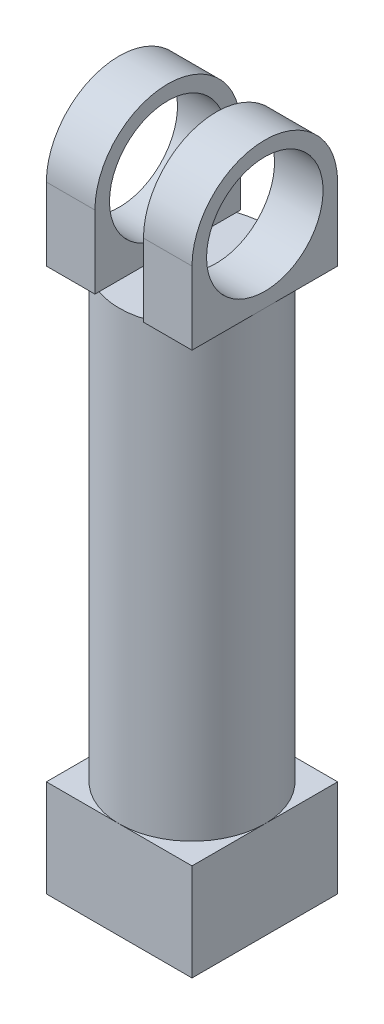
ISO-10303-21;
HEADER;
FILE_DESCRIPTION(('STEP AP214'),'2;1');
FILE_NAME('part.step','',(''),(''),'','','');
FILE_SCHEMA(('AUTOMOTIVE_DESIGN { 1 0 10303 214 1 1 1 1 }'));
ENDSEC;
DATA;
#1=APPLICATION_CONTEXT('core data for automotive mechanical design processes');
#2=APPLICATION_PROTOCOL_DEFINITION('international standard','automotive_design',2000,#1);
#3=PRODUCT_CONTEXT('',#1,'mechanical');
#4=PRODUCT('Part','Part','',(#3));
#5=PRODUCT_RELATED_PRODUCT_CATEGORY('part','',(#4));
#6=PRODUCT_DEFINITION_FORMATION('','',#4);
#7=PRODUCT_DEFINITION_CONTEXT('part definition',#1,'design');
#8=PRODUCT_DEFINITION('design','',#6,#7);
#9=PRODUCT_DEFINITION_SHAPE('','',#8);
#10=(LENGTH_UNIT() NAMED_UNIT(*) SI_UNIT(.MILLI.,.METRE.));
#11=(NAMED_UNIT(*) PLANE_ANGLE_UNIT() SI_UNIT($,.RADIAN.));
#12=(NAMED_UNIT(*) SI_UNIT($,.STERADIAN.) SOLID_ANGLE_UNIT());
#13=UNCERTAINTY_MEASURE_WITH_UNIT(LENGTH_MEASURE(1.E-05),#10,'distance_accuracy_value','');
#14=(GEOMETRIC_REPRESENTATION_CONTEXT(3) GLOBAL_UNCERTAINTY_ASSIGNED_CONTEXT((#13)) GLOBAL_UNIT_ASSIGNED_CONTEXT((#10,
#11,#12)) REPRESENTATION_CONTEXT('',''));
#15=CARTESIAN_POINT('',(0.,0.,0.));
#16=DIRECTION('',(0.,0.,1.));
#17=DIRECTION('',(1.,0.,0.));
#18=AXIS2_PLACEMENT_3D('',#15,#16,#17);
#19=CARTESIAN_POINT('',(0.,61.,-7.5));
#20=DIRECTION('',(0.,0.,1.));
#21=DIRECTION('',(1.,0.,0.));
#22=AXIS2_PLACEMENT_3D('',#19,#20,#21);
#23=PLANE('',#22);
#24=DIRECTION('',(0.,-1.,0.));
#25=VECTOR('',#24,1.);
#26=CARTESIAN_POINT('',(2.5,0.,-7.5));
#27=LINE('',#26,#25);
#28=CARTESIAN_POINT('',(2.5,53.5,-7.5));
#29=VERTEX_POINT('',#28);
#30=CARTESIAN_POINT('',(2.5,46.,-7.5));
#31=VERTEX_POINT('',#30);
#32=EDGE_CURVE('E204',#29,#31,#27,.T.);
#33=ORIENTED_EDGE('',*,*,#32,.F.);
#34=DIRECTION('',(-1.,0.,0.));
#35=VECTOR('',#34,1.);
#36=CARTESIAN_POINT('',(7.5,53.5,-7.5));
#37=LINE('',#36,#35);
#38=CARTESIAN_POINT('',(7.5,53.5,-7.5));
#39=VERTEX_POINT('',#38);
#40=EDGE_CURVE('E213',#39,#29,#37,.T.);
#41=ORIENTED_EDGE('',*,*,#40,.F.);
#42=DIRECTION('',(0.,-1.,0.));
#43=VECTOR('',#42,1.);
#44=CARTESIAN_POINT('',(7.5,61.,-7.5));
#45=LINE('',#44,#43);
#46=CARTESIAN_POINT('',(7.5,46.,-7.5));
#47=VERTEX_POINT('',#46);
#48=EDGE_CURVE('E260',#39,#47,#45,.T.);
#49=ORIENTED_EDGE('',*,*,#48,.T.);
#50=DIRECTION('',(-1.,0.,0.));
#51=VECTOR('',#50,1.);
#52=CARTESIAN_POINT('',(0.,46.,-7.5));
#53=LINE('',#52,#51);
#54=EDGE_CURVE('E256',#47,#31,#53,.T.);
#55=ORIENTED_EDGE('',*,*,#54,.T.);
#56=EDGE_LOOP('',(#33,#41,#49,#55));
#57=FACE_BOUND('',#56,.T.);
#58=ADVANCED_FACE('F67',(#57),#23,.F.);
#59=CARTESIAN_POINT('',(0.,46.,0.));
#60=DIRECTION('',(0.,-1.,0.));
#61=DIRECTION('',(0.,0.,-1.));
#62=AXIS2_PLACEMENT_3D('',#59,#60,#61);
#63=PLANE('',#62);
#64=DIRECTION('',(1.,0.,0.));
#65=VECTOR('',#64,1.);
#66=CARTESIAN_POINT('',(7.5,46.,7.5));
#67=LINE('',#66,#65);
#68=CARTESIAN_POINT('',(2.5,46.,7.5));
#69=VERTEX_POINT('',#68);
#70=CARTESIAN_POINT('',(7.5,46.,7.5));
#71=VERTEX_POINT('',#70);
#72=EDGE_CURVE('E245',#69,#71,#67,.T.);
#73=ORIENTED_EDGE('',*,*,#72,.F.);
#74=DIRECTION('',(0.,0.,1.));
#75=VECTOR('',#74,1.);
#76=CARTESIAN_POINT('',(2.5,46.,0.));
#77=LINE('',#76,#75);
#78=CARTESIAN_POINT('',(2.5,46.,7.07106781186548));
#79=VERTEX_POINT('',#78);
#80=EDGE_CURVE('E199',#79,#69,#77,.T.);
#81=ORIENTED_EDGE('',*,*,#80,.F.);
#82=CARTESIAN_POINT('',(0.,46.,0.));
#83=DIRECTION('',(0.,1.,0.));
#84=DIRECTION('',(0.,0.,1.));
#85=AXIS2_PLACEMENT_3D('',#82,#83,#84);
#86=CIRCLE('',#85,7.5);
#87=CARTESIAN_POINT('',(7.5,46.,0.));
#88=VERTEX_POINT('',#87);
#89=EDGE_CURVE('E77',#79,#88,#86,.T.);
#90=ORIENTED_EDGE('',*,*,#89,.T.);
#91=DIRECTION('',(0.,0.,-1.));
#92=VECTOR('',#91,1.);
#93=CARTESIAN_POINT('',(7.5,46.,-7.5));
#94=LINE('',#93,#92);
#95=EDGE_CURVE('E251',#71,#88,#94,.T.);
#96=ORIENTED_EDGE('',*,*,#95,.F.);
#97=EDGE_LOOP('',(#73,#81,#90,#96));
#98=FACE_BOUND('',#97,.T.);
#99=ADVANCED_FACE('F378',(#98),#63,.T.);
#100=CARTESIAN_POINT('',(2.5,46.,-7.07106781186548));
#101=VERTEX_POINT('',#100);
#102=EDGE_CURVE('E79',#88,#101,#86,.T.);
#103=ORIENTED_EDGE('',*,*,#102,.T.);
#104=EDGE_CURVE('E353',#31,#101,#77,.T.);
#105=ORIENTED_EDGE('',*,*,#104,.F.);
#106=ORIENTED_EDGE('',*,*,#54,.F.);
#107=EDGE_CURVE('E250',#88,#47,#94,.T.);
#108=ORIENTED_EDGE('',*,*,#107,.F.);
#109=EDGE_LOOP('',(#103,#105,#106,#108));
#110=FACE_BOUND('',#109,.T.);
#111=ADVANCED_FACE('F474',(#110),#63,.T.);
#112=CARTESIAN_POINT('',(7.5,61.,7.5));
#113=DIRECTION('',(0.,0.,-1.));
#114=DIRECTION('',(-1.,0.,0.));
#115=AXIS2_PLACEMENT_3D('',#112,#113,#114);
#116=PLANE('',#115);
#117=DIRECTION('',(0.,1.,0.));
#118=VECTOR('',#117,1.);
#119=CARTESIAN_POINT('',(2.5,0.,7.5));
#120=LINE('',#119,#118);
#121=CARTESIAN_POINT('',(2.5,53.5,7.5));
#122=VERTEX_POINT('',#121);
#123=EDGE_CURVE('E192',#69,#122,#120,.T.);
#124=ORIENTED_EDGE('',*,*,#123,.F.);
#125=ORIENTED_EDGE('',*,*,#72,.T.);
#126=DIRECTION('',(0.,-1.,0.));
#127=VECTOR('',#126,1.);
#128=CARTESIAN_POINT('',(7.5,61.,7.5));
#129=LINE('',#128,#127);
#130=CARTESIAN_POINT('',(7.5,53.5,7.5));
#131=VERTEX_POINT('',#130);
#132=EDGE_CURVE('E220',#131,#71,#129,.T.);
#133=ORIENTED_EDGE('',*,*,#132,.F.);
#134=DIRECTION('',(-1.,0.,0.));
#135=VECTOR('',#134,1.);
#136=CARTESIAN_POINT('',(7.5,53.5,7.5));
#137=LINE('',#136,#135);
#138=EDGE_CURVE('E210',#131,#122,#137,.T.);
#139=ORIENTED_EDGE('',*,*,#138,.T.);
#140=EDGE_LOOP('',(#124,#125,#133,#139));
#141=FACE_BOUND('',#140,.T.);
#142=ADVANCED_FACE('F218',(#141),#116,.F.);
#143=CARTESIAN_POINT('',(7.5,53.5,0.));
#144=DIRECTION('',(-1.,0.,0.));
#145=DIRECTION('',(0.,0.,1.));
#146=AXIS2_PLACEMENT_3D('',#143,#144,#145);
#147=CYLINDRICAL_SURFACE('',#146,7.5);
#148=ORIENTED_EDGE('',*,*,#40,.T.);
#149=CARTESIAN_POINT('',(2.5,53.5,0.));
#150=DIRECTION('',(-1.,0.,0.));
#151=DIRECTION('',(0.,0.,1.));
#152=AXIS2_PLACEMENT_3D('',#149,#150,#151);
#153=CIRCLE('',#152,7.5);
#154=EDGE_CURVE('E195',#122,#29,#153,.T.);
#155=ORIENTED_EDGE('',*,*,#154,.F.);
#156=ORIENTED_EDGE('',*,*,#138,.F.);
#157=CARTESIAN_POINT('',(7.5,53.5,0.));
#158=DIRECTION('',(-1.,0.,0.));
#159=DIRECTION('',(0.,0.,1.));
#160=AXIS2_PLACEMENT_3D('',#157,#158,#159);
#161=CIRCLE('',#160,7.5);
#162=EDGE_CURVE('E228',#131,#39,#161,.T.);
#163=ORIENTED_EDGE('',*,*,#162,.T.);
#164=EDGE_LOOP('',(#148,#155,#156,#163));
#165=FACE_BOUND('',#164,.T.);
#166=ADVANCED_FACE('F209',(#165),#147,.T.);
#167=CARTESIAN_POINT('',(7.5,53.5,0.));
#168=DIRECTION('',(-1.,0.,0.));
#169=DIRECTION('',(0.,0.,1.));
#170=AXIS2_PLACEMENT_3D('',#167,#168,#169);
#171=CYLINDRICAL_SURFACE('',#170,6.);
#172=CARTESIAN_POINT('',(7.5,53.5,0.));
#173=DIRECTION('',(-1.,0.,0.));
#174=DIRECTION('',(0.,0.,1.));
#175=AXIS2_PLACEMENT_3D('',#172,#173,#174);
#176=CIRCLE('',#175,6.);
#177=CARTESIAN_POINT('',(7.5,53.5,6.));
#178=VERTEX_POINT('',#177);
#179=EDGE_CURVE('E230',#178,#178,#176,.T.);
#180=ORIENTED_EDGE('',*,*,#179,.F.);
#181=EDGE_LOOP('',(#180));
#182=FACE_BOUND('',#181,.T.);
#183=CARTESIAN_POINT('',(2.5,53.5,0.));
#184=DIRECTION('',(-1.,0.,0.));
#185=DIRECTION('',(0.,0.,1.));
#186=AXIS2_PLACEMENT_3D('',#183,#184,#185);
#187=CIRCLE('',#186,6.);
#188=CARTESIAN_POINT('',(2.5,53.5,6.));
#189=VERTEX_POINT('',#188);
#190=EDGE_CURVE('E71',#189,#189,#187,.F.);
#191=ORIENTED_EDGE('',*,*,#190,.F.);
#192=EDGE_LOOP('',(#191));
#193=FACE_BOUND('',#192,.T.);
#194=ADVANCED_FACE('F487',(#182,#193),#171,.F.);
#195=CARTESIAN_POINT('',(-7.5,61.,7.5));
#196=DIRECTION('',(1.,0.,0.));
#197=DIRECTION('',(0.,0.,-1.));
#198=AXIS2_PLACEMENT_3D('',#195,#196,#197);
#199=PLANE('',#198);
#200=CARTESIAN_POINT('',(-7.5,53.5,0.));
#201=DIRECTION('',(-1.,0.,0.));
#202=DIRECTION('',(0.,0.,1.));
#203=AXIS2_PLACEMENT_3D('',#200,#201,#202);
#204=CIRCLE('',#203,6.);
#205=CARTESIAN_POINT('',(-7.5,53.5,6.));
#206=VERTEX_POINT('',#205);
#207=EDGE_CURVE('E233',#206,#206,#204,.T.);
#208=ORIENTED_EDGE('',*,*,#207,.F.);
#209=EDGE_LOOP('',(#208));
#210=FACE_BOUND('',#209,.T.);
#211=DIRECTION('',(0.,-1.,0.));
#212=VECTOR('',#211,1.);
#213=CARTESIAN_POINT('',(-7.5,61.,7.5));
#214=LINE('',#213,#212);
#215=CARTESIAN_POINT('',(-7.5,53.5,7.5));
#216=VERTEX_POINT('',#215);
#217=CARTESIAN_POINT('',(-7.5,46.,7.5));
#218=VERTEX_POINT('',#217);
#219=EDGE_CURVE('E265',#216,#218,#214,.T.);
#220=ORIENTED_EDGE('',*,*,#219,.F.);
#221=CARTESIAN_POINT('',(-7.5,53.5,0.));
#222=DIRECTION('',(-1.,0.,0.));
#223=DIRECTION('',(0.,0.,1.));
#224=AXIS2_PLACEMENT_3D('',#221,#222,#223);
#225=CIRCLE('',#224,7.5);
#226=CARTESIAN_POINT('',(-7.5,53.5,-7.5));
#227=VERTEX_POINT('',#226);
#228=EDGE_CURVE('E222',#216,#227,#225,.T.);
#229=ORIENTED_EDGE('',*,*,#228,.T.);
#230=DIRECTION('',(0.,-1.,0.));
#231=VECTOR('',#230,1.);
#232=CARTESIAN_POINT('',(-7.5,61.,-7.5));
#233=LINE('',#232,#231);
#234=CARTESIAN_POINT('',(-7.5,46.,-7.5));
#235=VERTEX_POINT('',#234);
#236=EDGE_CURVE('E268',#227,#235,#233,.T.);
#237=ORIENTED_EDGE('',*,*,#236,.T.);
#238=DIRECTION('',(0.,0.,1.));
#239=VECTOR('',#238,1.);
#240=CARTESIAN_POINT('',(-7.5,46.,7.5));
#241=LINE('',#240,#239);
#242=CARTESIAN_POINT('',(-7.5,46.,0.));
#243=VERTEX_POINT('',#242);
#244=EDGE_CURVE('E241',#235,#243,#241,.T.);
#245=ORIENTED_EDGE('',*,*,#244,.T.);
#246=EDGE_CURVE('E240',#243,#218,#241,.T.);
#247=ORIENTED_EDGE('',*,*,#246,.T.);
#248=EDGE_LOOP('',(#220,#229,#237,#245,#247));
#249=FACE_BOUND('',#248,.T.);
#250=ADVANCED_FACE('F483',(#210,#249),#199,.F.);
#251=CARTESIAN_POINT('',(7.5,61.,-7.5));
#252=DIRECTION('',(-1.,0.,0.));
#253=DIRECTION('',(0.,0.,1.));
#254=AXIS2_PLACEMENT_3D('',#251,#252,#253);
#255=PLANE('',#254);
#256=ORIENTED_EDGE('',*,*,#179,.T.);
#257=EDGE_LOOP('',(#256));
#258=FACE_BOUND('',#257,.T.);
#259=ORIENTED_EDGE('',*,*,#162,.F.);
#260=ORIENTED_EDGE('',*,*,#132,.T.);
#261=ORIENTED_EDGE('',*,*,#95,.T.);
#262=ORIENTED_EDGE('',*,*,#107,.T.);
#263=ORIENTED_EDGE('',*,*,#48,.F.);
#264=EDGE_LOOP('',(#259,#260,#261,#262,#263));
#265=FACE_BOUND('',#264,.T.);
#266=ADVANCED_FACE('F478',(#258,#265),#255,.F.);
#267=CARTESIAN_POINT('',(-2.5,53.5,-7.5));
#268=VERTEX_POINT('',#267);
#269=EDGE_CURVE('E236',#268,#227,#37,.T.);
#270=ORIENTED_EDGE('',*,*,#269,.F.);
#271=DIRECTION('',(0.,-1.,0.));
#272=VECTOR('',#271,1.);
#273=CARTESIAN_POINT('',(-2.5,0.,-7.5));
#274=LINE('',#273,#272);
#275=CARTESIAN_POINT('',(-2.5,46.,-7.5));
#276=VERTEX_POINT('',#275);
#277=EDGE_CURVE('E86',#268,#276,#274,.T.);
#278=ORIENTED_EDGE('',*,*,#277,.T.);
#279=EDGE_CURVE('E255',#276,#235,#53,.T.);
#280=ORIENTED_EDGE('',*,*,#279,.T.);
#281=ORIENTED_EDGE('',*,*,#236,.F.);
#282=EDGE_LOOP('',(#270,#278,#280,#281));
#283=FACE_BOUND('',#282,.T.);
#284=ADVANCED_FACE('F405',(#283),#23,.F.);
#285=CARTESIAN_POINT('',(0.,46.,0.));
#286=DIRECTION('',(0.,-1.,0.));
#287=DIRECTION('',(0.,0.,-1.));
#288=AXIS2_PLACEMENT_3D('',#285,#286,#287);
#289=CYLINDRICAL_SURFACE('',#288,7.5);
#290=CARTESIAN_POINT('',(-2.5,46.,7.07106781186548));
#291=VERTEX_POINT('',#290);
#292=EDGE_CURVE('E12',#291,#79,#86,.T.);
#293=ORIENTED_EDGE('',*,*,#292,.F.);
#294=EDGE_CURVE('E333',#243,#291,#86,.T.);
#295=ORIENTED_EDGE('',*,*,#294,.F.);
#296=CARTESIAN_POINT('',(-2.5,46.,-7.07106781186548));
#297=VERTEX_POINT('',#296);
#298=EDGE_CURVE('E94',#297,#243,#86,.T.);
#299=ORIENTED_EDGE('',*,*,#298,.F.);
#300=EDGE_CURVE('E387',#101,#297,#86,.T.);
#301=ORIENTED_EDGE('',*,*,#300,.F.);
#302=ORIENTED_EDGE('',*,*,#102,.F.);
#303=ORIENTED_EDGE('',*,*,#89,.F.);
#304=EDGE_LOOP('',(#293,#295,#299,#301,#302,#303));
#305=FACE_BOUND('',#304,.T.);
#306=CARTESIAN_POINT('',(0.,0.,0.));
#307=DIRECTION('',(0.,1.,0.));
#308=DIRECTION('',(0.,0.,1.));
#309=AXIS2_PLACEMENT_3D('',#306,#307,#308);
#310=CIRCLE('',#309,7.5);
#311=CARTESIAN_POINT('',(0.,0.,7.5));
#312=VERTEX_POINT('',#311);
#313=CARTESIAN_POINT('',(7.5,0.,0.));
#314=VERTEX_POINT('',#313);
#315=EDGE_CURVE('E330',#312,#314,#310,.T.);
#316=ORIENTED_EDGE('',*,*,#315,.T.);
#317=CARTESIAN_POINT('',(0.,0.,-7.5));
#318=VERTEX_POINT('',#317);
#319=EDGE_CURVE('E334',#314,#318,#310,.T.);
#320=ORIENTED_EDGE('',*,*,#319,.T.);
#321=CARTESIAN_POINT('',(-7.5,0.,0.));
#322=VERTEX_POINT('',#321);
#323=EDGE_CURVE('E422',#318,#322,#310,.T.);
#324=ORIENTED_EDGE('',*,*,#323,.T.);
#325=EDGE_CURVE('E302',#322,#312,#310,.T.);
#326=ORIENTED_EDGE('',*,*,#325,.T.);
#327=EDGE_LOOP('',(#316,#320,#324,#326));
#328=FACE_BOUND('',#327,.T.);
#329=ADVANCED_FACE('F69',(#305,#328),#289,.T.);
#330=CARTESIAN_POINT('',(0.,0.,0.));
#331=DIRECTION('',(0.,-1.,0.));
#332=DIRECTION('',(0.,0.,-1.));
#333=AXIS2_PLACEMENT_3D('',#330,#331,#332);
#334=PLANE('',#333);
#335=ORIENTED_EDGE('',*,*,#315,.F.);
#336=DIRECTION('',(1.,0.,0.));
#337=VECTOR('',#336,1.);
#338=CARTESIAN_POINT('',(0.,0.,7.5));
#339=LINE('',#338,#337);
#340=CARTESIAN_POINT('',(7.5,0.,7.5));
#341=VERTEX_POINT('',#340);
#342=EDGE_CURVE('E277',#312,#341,#339,.T.);
#343=ORIENTED_EDGE('',*,*,#342,.T.);
#344=DIRECTION('',(0.,0.,-1.));
#345=VECTOR('',#344,1.);
#346=CARTESIAN_POINT('',(7.5,0.,0.));
#347=LINE('',#346,#345);
#348=EDGE_CURVE('E285',#341,#314,#347,.T.);
#349=ORIENTED_EDGE('',*,*,#348,.T.);
#350=EDGE_LOOP('',(#335,#343,#349));
#351=FACE_BOUND('',#350,.T.);
#352=ADVANCED_FACE('F436',(#351),#334,.F.);
#353=ORIENTED_EDGE('',*,*,#319,.F.);
#354=CARTESIAN_POINT('',(7.5,0.,-7.5));
#355=VERTEX_POINT('',#354);
#356=EDGE_CURVE('E294',#314,#355,#347,.T.);
#357=ORIENTED_EDGE('',*,*,#356,.T.);
#358=DIRECTION('',(-1.,0.,0.));
#359=VECTOR('',#358,1.);
#360=CARTESIAN_POINT('',(0.,0.,-7.5));
#361=LINE('',#360,#359);
#362=EDGE_CURVE('E290',#355,#318,#361,.T.);
#363=ORIENTED_EDGE('',*,*,#362,.T.);
#364=EDGE_LOOP('',(#353,#357,#363));
#365=FACE_BOUND('',#364,.T.);
#366=ADVANCED_FACE('F429',(#365),#334,.F.);
#367=ORIENTED_EDGE('',*,*,#323,.F.);
#368=CARTESIAN_POINT('',(-7.5,0.,-7.5));
#369=VERTEX_POINT('',#368);
#370=EDGE_CURVE('E295',#318,#369,#361,.T.);
#371=ORIENTED_EDGE('',*,*,#370,.T.);
#372=DIRECTION('',(0.,0.,1.));
#373=VECTOR('',#372,1.);
#374=CARTESIAN_POINT('',(-7.5,0.,-7.5));
#375=LINE('',#374,#373);
#376=EDGE_CURVE('E308',#369,#322,#375,.T.);
#377=ORIENTED_EDGE('',*,*,#376,.T.);
#378=EDGE_LOOP('',(#367,#371,#377));
#379=FACE_BOUND('',#378,.T.);
#380=ADVANCED_FACE('F456',(#379),#334,.F.);
#381=CARTESIAN_POINT('',(7.5,-10.,0.));
#382=DIRECTION('',(1.,0.,0.));
#383=DIRECTION('',(0.,0.,-1.));
#384=AXIS2_PLACEMENT_3D('',#381,#382,#383);
#385=PLANE('',#384);
#386=ORIENTED_EDGE('',*,*,#348,.F.);
#387=DIRECTION('',(0.,1.,0.));
#388=VECTOR('',#387,1.);
#389=CARTESIAN_POINT('',(7.5,-10.,7.5));
#390=LINE('',#389,#388);
#391=CARTESIAN_POINT('',(7.5,-10.,7.5));
#392=VERTEX_POINT('',#391);
#393=EDGE_CURVE('E311',#392,#341,#390,.T.);
#394=ORIENTED_EDGE('',*,*,#393,.F.);
#395=DIRECTION('',(0.,0.,-1.));
#396=VECTOR('',#395,1.);
#397=CARTESIAN_POINT('',(7.5,-10.,0.));
#398=LINE('',#397,#396);
#399=CARTESIAN_POINT('',(7.5,-10.,-7.5));
#400=VERTEX_POINT('',#399);
#401=EDGE_CURVE('E284',#392,#400,#398,.T.);
#402=ORIENTED_EDGE('',*,*,#401,.T.);
#403=DIRECTION('',(0.,1.,0.));
#404=VECTOR('',#403,1.);
#405=CARTESIAN_POINT('',(7.5,-10.,-7.5));
#406=LINE('',#405,#404);
#407=EDGE_CURVE('E289',#400,#355,#406,.T.);
#408=ORIENTED_EDGE('',*,*,#407,.T.);
#409=ORIENTED_EDGE('',*,*,#356,.F.);
#410=EDGE_LOOP('',(#386,#394,#402,#408,#409));
#411=FACE_BOUND('',#410,.T.);
#412=ADVANCED_FACE('F433',(#411),#385,.T.);
#413=ORIENTED_EDGE('',*,*,#325,.F.);
#414=CARTESIAN_POINT('',(-7.5,0.,7.5));
#415=VERTEX_POINT('',#414);
#416=EDGE_CURVE('E315',#322,#415,#375,.T.);
#417=ORIENTED_EDGE('',*,*,#416,.T.);
#418=EDGE_CURVE('E312',#415,#312,#339,.T.);
#419=ORIENTED_EDGE('',*,*,#418,.T.);
#420=EDGE_LOOP('',(#413,#417,#419));
#421=FACE_BOUND('',#420,.T.);
#422=ADVANCED_FACE('F459',(#421),#334,.F.);
#423=CARTESIAN_POINT('',(0.,-10.,-7.5));
#424=DIRECTION('',(0.,0.,-1.));
#425=DIRECTION('',(-1.,0.,0.));
#426=AXIS2_PLACEMENT_3D('',#423,#424,#425);
#427=PLANE('',#426);
#428=ORIENTED_EDGE('',*,*,#362,.F.);
#429=ORIENTED_EDGE('',*,*,#407,.F.);
#430=DIRECTION('',(-1.,0.,0.));
#431=VECTOR('',#430,1.);
#432=CARTESIAN_POINT('',(0.,-10.,-7.5));
#433=LINE('',#432,#431);
#434=CARTESIAN_POINT('',(-7.5,-10.,-7.5));
#435=VERTEX_POINT('',#434);
#436=EDGE_CURVE('E281',#400,#435,#433,.T.);
#437=ORIENTED_EDGE('',*,*,#436,.T.);
#438=DIRECTION('',(0.,1.,0.));
#439=VECTOR('',#438,1.);
#440=CARTESIAN_POINT('',(-7.5,-10.,-7.5));
#441=LINE('',#440,#439);
#442=EDGE_CURVE('E323',#435,#369,#441,.T.);
#443=ORIENTED_EDGE('',*,*,#442,.T.);
#444=ORIENTED_EDGE('',*,*,#370,.F.);
#445=EDGE_LOOP('',(#428,#429,#437,#443,#444));
#446=FACE_BOUND('',#445,.T.);
#447=ADVANCED_FACE('F449',(#446),#427,.T.);
#448=CARTESIAN_POINT('',(0.,-10.,0.));
#449=DIRECTION('',(0.,-1.,0.));
#450=DIRECTION('',(0.,0.,-1.));
#451=AXIS2_PLACEMENT_3D('',#448,#449,#450);
#452=PLANE('',#451);
#453=ORIENTED_EDGE('',*,*,#401,.F.);
#454=DIRECTION('',(1.,0.,0.));
#455=VECTOR('',#454,1.);
#456=CARTESIAN_POINT('',(-7.5,-10.,7.5));
#457=LINE('',#456,#455);
#458=CARTESIAN_POINT('',(-7.5,-10.,7.5));
#459=VERTEX_POINT('',#458);
#460=EDGE_CURVE('E303',#459,#392,#457,.T.);
#461=ORIENTED_EDGE('',*,*,#460,.F.);
#462=DIRECTION('',(0.,0.,1.));
#463=VECTOR('',#462,1.);
#464=CARTESIAN_POINT('',(-7.5,-10.,-7.5));
#465=LINE('',#464,#463);
#466=EDGE_CURVE('E307',#435,#459,#465,.T.);
#467=ORIENTED_EDGE('',*,*,#466,.F.);
#468=ORIENTED_EDGE('',*,*,#436,.F.);
#469=EDGE_LOOP('',(#453,#461,#467,#468));
#470=FACE_BOUND('',#469,.T.);
#471=ADVANCED_FACE('F445',(#470),#452,.T.);
#472=CARTESIAN_POINT('',(-7.5,-10.,-7.5));
#473=DIRECTION('',(-1.,0.,0.));
#474=DIRECTION('',(0.,0.,1.));
#475=AXIS2_PLACEMENT_3D('',#472,#473,#474);
#476=PLANE('',#475);
#477=CARTESIAN_POINT('',(-7.5,-5.,0.));
#478=DIRECTION('',(-1.,0.,0.));
#479=DIRECTION('',(0.,0.,1.));
#480=AXIS2_PLACEMENT_3D('',#477,#478,#479);
#481=CIRCLE('',#480,2.5);
#482=CARTESIAN_POINT('',(-7.5,-5.,2.5));
#483=VERTEX_POINT('',#482);
#484=EDGE_CURVE('E272',#483,#483,#481,.T.);
#485=ORIENTED_EDGE('',*,*,#484,.F.);
#486=EDGE_LOOP('',(#485));
#487=FACE_BOUND('',#486,.T.);
#488=DIRECTION('',(0.,1.,0.));
#489=VECTOR('',#488,1.);
#490=CARTESIAN_POINT('',(-7.5,-10.,7.5));
#491=LINE('',#490,#489);
#492=EDGE_CURVE('E319',#459,#415,#491,.T.);
#493=ORIENTED_EDGE('',*,*,#492,.T.);
#494=ORIENTED_EDGE('',*,*,#416,.F.);
#495=ORIENTED_EDGE('',*,*,#376,.F.);
#496=ORIENTED_EDGE('',*,*,#442,.F.);
#497=ORIENTED_EDGE('',*,*,#466,.T.);
#498=EDGE_LOOP('',(#493,#494,#495,#496,#497));
#499=FACE_BOUND('',#498,.T.);
#500=ADVANCED_FACE('F453',(#487,#499),#476,.T.);
#501=CARTESIAN_POINT('',(0.,-10.,7.5));
#502=DIRECTION('',(0.,0.,1.));
#503=DIRECTION('',(1.,0.,0.));
#504=AXIS2_PLACEMENT_3D('',#501,#502,#503);
#505=PLANE('',#504);
#506=ORIENTED_EDGE('',*,*,#393,.T.);
#507=ORIENTED_EDGE('',*,*,#342,.F.);
#508=ORIENTED_EDGE('',*,*,#418,.F.);
#509=ORIENTED_EDGE('',*,*,#492,.F.);
#510=ORIENTED_EDGE('',*,*,#460,.T.);
#511=EDGE_LOOP('',(#506,#507,#508,#509,#510));
#512=FACE_BOUND('',#511,.T.);
#513=ADVANCED_FACE('F440',(#512),#505,.T.);
#514=CARTESIAN_POINT('',(0.,-5.,0.));
#515=DIRECTION('',(-1.,0.,0.));
#516=DIRECTION('',(0.,0.,1.));
#517=AXIS2_PLACEMENT_3D('',#514,#515,#516);
#518=CYLINDRICAL_SURFACE('',#517,2.5);
#519=CARTESIAN_POINT('',(0.,-5.,0.));
#520=DIRECTION('',(-1.,0.,0.));
#521=DIRECTION('',(0.,0.,1.));
#522=AXIS2_PLACEMENT_3D('',#519,#520,#521);
#523=CIRCLE('',#522,2.5);
#524=CARTESIAN_POINT('',(0.,-5.,2.5));
#525=VERTEX_POINT('',#524);
#526=EDGE_CURVE('E273',#525,#525,#523,.T.);
#527=ORIENTED_EDGE('',*,*,#526,.F.);
#528=EDGE_LOOP('',(#527));
#529=FACE_BOUND('',#528,.T.);
#530=ORIENTED_EDGE('',*,*,#484,.T.);
#531=EDGE_LOOP('',(#530));
#532=FACE_BOUND('',#531,.T.);
#533=ADVANCED_FACE('F499',(#529,#532),#518,.F.);
#534=CARTESIAN_POINT('',(0.,0.,0.));
#535=DIRECTION('',(-1.,0.,0.));
#536=DIRECTION('',(0.,0.,1.));
#537=AXIS2_PLACEMENT_3D('',#534,#535,#536);
#538=PLANE('',#537);
#539=ORIENTED_EDGE('',*,*,#526,.T.);
#540=EDGE_LOOP('',(#539));
#541=FACE_BOUND('',#540,.T.);
#542=ADVANCED_FACE('F496',(#541),#538,.T.);
#543=DIRECTION('',(0.,0.,1.));
#544=VECTOR('',#543,1.);
#545=CARTESIAN_POINT('',(-2.5,46.,0.));
#546=LINE('',#545,#544);
#547=EDGE_CURVE('E205',#276,#297,#546,.T.);
#548=ORIENTED_EDGE('',*,*,#547,.T.);
#549=ORIENTED_EDGE('',*,*,#298,.T.);
#550=ORIENTED_EDGE('',*,*,#244,.F.);
#551=ORIENTED_EDGE('',*,*,#279,.F.);
#552=EDGE_LOOP('',(#548,#549,#550,#551));
#553=FACE_BOUND('',#552,.T.);
#554=ADVANCED_FACE('F401',(#553),#63,.T.);
#555=CARTESIAN_POINT('',(-2.5,46.,7.5));
#556=VERTEX_POINT('',#555);
#557=EDGE_CURVE('E246',#218,#556,#67,.T.);
#558=ORIENTED_EDGE('',*,*,#557,.T.);
#559=DIRECTION('',(0.,1.,0.));
#560=VECTOR('',#559,1.);
#561=CARTESIAN_POINT('',(-2.5,0.,7.5));
#562=LINE('',#561,#560);
#563=CARTESIAN_POINT('',(-2.5,53.5,7.5));
#564=VERTEX_POINT('',#563);
#565=EDGE_CURVE('E361',#556,#564,#562,.T.);
#566=ORIENTED_EDGE('',*,*,#565,.T.);
#567=EDGE_CURVE('E223',#564,#216,#137,.T.);
#568=ORIENTED_EDGE('',*,*,#567,.T.);
#569=ORIENTED_EDGE('',*,*,#219,.T.);
#570=EDGE_LOOP('',(#558,#566,#568,#569));
#571=FACE_BOUND('',#570,.T.);
#572=ADVANCED_FACE('F492',(#571),#116,.F.);
#573=EDGE_CURVE('E358',#291,#556,#546,.T.);
#574=ORIENTED_EDGE('',*,*,#573,.T.);
#575=ORIENTED_EDGE('',*,*,#557,.F.);
#576=ORIENTED_EDGE('',*,*,#246,.F.);
#577=ORIENTED_EDGE('',*,*,#294,.T.);
#578=EDGE_LOOP('',(#574,#575,#576,#577));
#579=FACE_BOUND('',#578,.T.);
#580=ADVANCED_FACE('F395',(#579),#63,.T.);
#581=CARTESIAN_POINT('',(-2.5,53.5,0.));
#582=DIRECTION('',(-1.,0.,0.));
#583=DIRECTION('',(0.,0.,1.));
#584=AXIS2_PLACEMENT_3D('',#581,#582,#583);
#585=CIRCLE('',#584,7.5);
#586=EDGE_CURVE('E216',#564,#268,#585,.T.);
#587=ORIENTED_EDGE('',*,*,#586,.T.);
#588=ORIENTED_EDGE('',*,*,#269,.T.);
#589=ORIENTED_EDGE('',*,*,#228,.F.);
#590=ORIENTED_EDGE('',*,*,#567,.F.);
#591=EDGE_LOOP('',(#587,#588,#589,#590));
#592=FACE_BOUND('',#591,.T.);
#593=ADVANCED_FACE('F543',(#592),#147,.T.);
#594=CARTESIAN_POINT('',(-2.5,53.5,0.));
#595=DIRECTION('',(-1.,0.,0.));
#596=DIRECTION('',(0.,0.,1.));
#597=AXIS2_PLACEMENT_3D('',#594,#595,#596);
#598=CIRCLE('',#597,6.);
#599=CARTESIAN_POINT('',(-2.5,53.5,6.));
#600=VERTEX_POINT('',#599);
#601=EDGE_CURVE('E215',#600,#600,#598,.F.);
#602=ORIENTED_EDGE('',*,*,#601,.T.);
#603=EDGE_LOOP('',(#602));
#604=FACE_BOUND('',#603,.T.);
#605=ORIENTED_EDGE('',*,*,#207,.T.);
#606=EDGE_LOOP('',(#605));
#607=FACE_BOUND('',#606,.T.);
#608=ADVANCED_FACE('F549',(#604,#607),#171,.F.);
#609=CARTESIAN_POINT('',(2.5,53.5,0.));
#610=DIRECTION('',(-1.,0.,0.));
#611=DIRECTION('',(0.,0.,1.));
#612=AXIS2_PLACEMENT_3D('',#609,#610,#611);
#613=PLANE('',#612);
#614=ORIENTED_EDGE('',*,*,#190,.T.);
#615=EDGE_LOOP('',(#614));
#616=FACE_BOUND('',#615,.T.);
#617=ORIENTED_EDGE('',*,*,#154,.T.);
#618=ORIENTED_EDGE('',*,*,#32,.T.);
#619=ORIENTED_EDGE('',*,*,#104,.T.);
#620=EDGE_CURVE('E367',#101,#79,#77,.T.);
#621=ORIENTED_EDGE('',*,*,#620,.T.);
#622=ORIENTED_EDGE('',*,*,#80,.T.);
#623=ORIENTED_EDGE('',*,*,#123,.T.);
#624=EDGE_LOOP('',(#617,#618,#619,#621,#622,#623));
#625=FACE_BOUND('',#624,.T.);
#626=ADVANCED_FACE('F194',(#616,#625),#613,.T.);
#627=CARTESIAN_POINT('',(-2.5,53.5,0.));
#628=DIRECTION('',(-1.,0.,0.));
#629=DIRECTION('',(0.,0.,1.));
#630=AXIS2_PLACEMENT_3D('',#627,#628,#629);
#631=PLANE('',#630);
#632=ORIENTED_EDGE('',*,*,#601,.F.);
#633=EDGE_LOOP('',(#632));
#634=FACE_BOUND('',#633,.T.);
#635=ORIENTED_EDGE('',*,*,#277,.F.);
#636=ORIENTED_EDGE('',*,*,#586,.F.);
#637=ORIENTED_EDGE('',*,*,#565,.F.);
#638=ORIENTED_EDGE('',*,*,#573,.F.);
#639=EDGE_CURVE('E357',#297,#291,#546,.T.);
#640=ORIENTED_EDGE('',*,*,#639,.F.);
#641=ORIENTED_EDGE('',*,*,#547,.F.);
#642=EDGE_LOOP('',(#635,#636,#637,#638,#640,#641));
#643=FACE_BOUND('',#642,.T.);
#644=ADVANCED_FACE('F402',(#634,#643),#631,.F.);
#645=CARTESIAN_POINT('',(2.5,46.,0.));
#646=DIRECTION('',(0.,-1.,0.));
#647=DIRECTION('',(0.,0.,-1.));
#648=AXIS2_PLACEMENT_3D('',#645,#646,#647);
#649=PLANE('',#648);
#650=ORIENTED_EDGE('',*,*,#620,.F.);
#651=ORIENTED_EDGE('',*,*,#300,.T.);
#652=ORIENTED_EDGE('',*,*,#639,.T.);
#653=ORIENTED_EDGE('',*,*,#292,.T.);
#654=EDGE_LOOP('',(#650,#651,#652,#653));
#655=FACE_BOUND('',#654,.T.);
#656=ADVANCED_FACE('F399',(#655),#649,.F.);
#657=CLOSED_SHELL('',(#58,#99,#111,#142,#166,#194,#250,#266,#284,#329,#352,#366,#380,#412,#422,
#447,#471,#500,#513,#533,#542,#554,#572,#580,#593,#608,#626,#644,#656));
#658=MANIFOLD_SOLID_BREP('B2',#657);
#659=ADVANCED_BREP_SHAPE_REPRESENTATION('',(#18,#658),#14);
#660=SHAPE_DEFINITION_REPRESENTATION(#9,#659);
ENDSEC;
END-ISO-10303-21;
